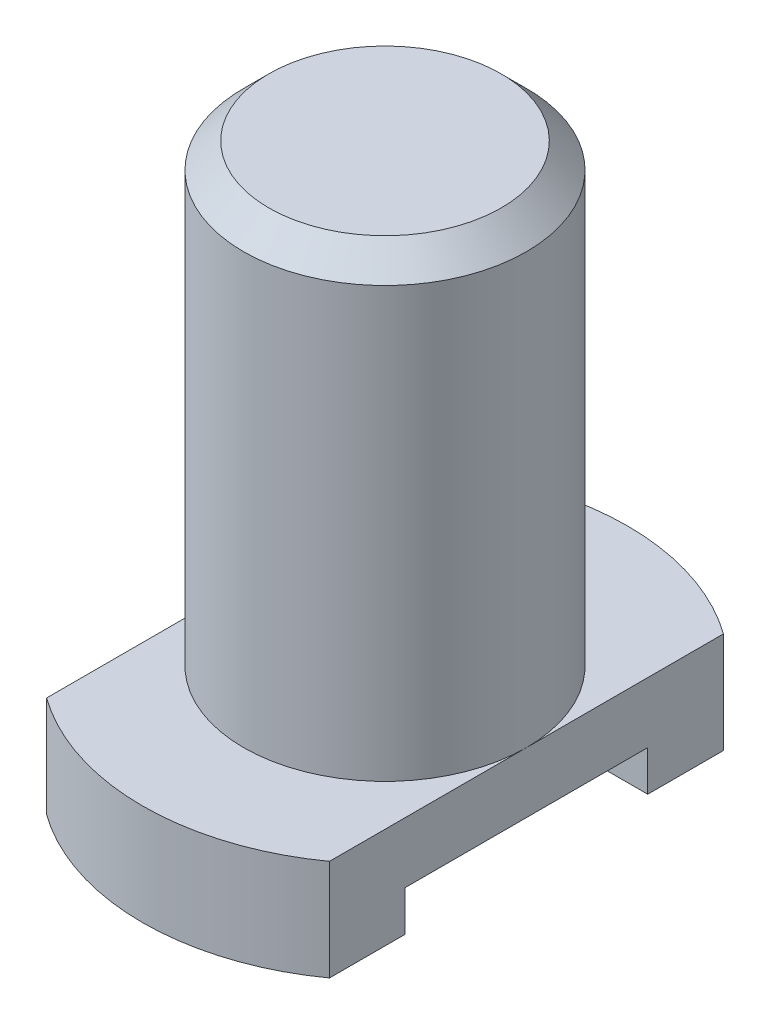
ISO-10303-21;
HEADER;
FILE_DESCRIPTION(('STEP AP214'),'2;1');
FILE_NAME('part.step','',(''),(''),'','','');
FILE_SCHEMA(('AUTOMOTIVE_DESIGN { 1 0 10303 214 1 1 1 1 }'));
ENDSEC;
DATA;
#1=APPLICATION_CONTEXT('core data for automotive mechanical design processes');
#2=APPLICATION_PROTOCOL_DEFINITION('international standard','automotive_design',2000,#1);
#3=PRODUCT_CONTEXT('',#1,'mechanical');
#4=PRODUCT('Part','Part','',(#3));
#5=PRODUCT_RELATED_PRODUCT_CATEGORY('part','',(#4));
#6=PRODUCT_DEFINITION_FORMATION('','',#4);
#7=PRODUCT_DEFINITION_CONTEXT('part definition',#1,'design');
#8=PRODUCT_DEFINITION('design','',#6,#7);
#9=PRODUCT_DEFINITION_SHAPE('','',#8);
#10=(LENGTH_UNIT() NAMED_UNIT(*) SI_UNIT(.MILLI.,.METRE.));
#11=(NAMED_UNIT(*) PLANE_ANGLE_UNIT() SI_UNIT($,.RADIAN.));
#12=(NAMED_UNIT(*) SI_UNIT($,.STERADIAN.) SOLID_ANGLE_UNIT());
#13=UNCERTAINTY_MEASURE_WITH_UNIT(LENGTH_MEASURE(1.E-05),#10,'distance_accuracy_value','');
#14=(GEOMETRIC_REPRESENTATION_CONTEXT(3) GLOBAL_UNCERTAINTY_ASSIGNED_CONTEXT((#13)) GLOBAL_UNIT_ASSIGNED_CONTEXT((#10,
#11,#12)) REPRESENTATION_CONTEXT('',''));
#15=CARTESIAN_POINT('',(0.,0.,0.));
#16=DIRECTION('',(0.,0.,1.));
#17=DIRECTION('',(1.,0.,0.));
#18=AXIS2_PLACEMENT_3D('',#15,#16,#17);
#19=CARTESIAN_POINT('',(0.,0.,0.));
#20=DIRECTION('',(0.,1.,0.));
#21=DIRECTION('',(0.,0.,1.));
#22=AXIS2_PLACEMENT_3D('',#19,#20,#21);
#23=PLANE('',#22);
#24=DIRECTION('',(0.,0.,-1.));
#25=VECTOR('',#24,1.);
#26=CARTESIAN_POINT('',(1.4,0.,0.));
#27=LINE('',#26,#25);
#28=CARTESIAN_POINT('',(1.4,0.,-1.2));
#29=VERTEX_POINT('',#28);
#30=CARTESIAN_POINT('',(1.4,0.,-1.94935886896179));
#31=VERTEX_POINT('',#30);
#32=EDGE_CURVE('E133',#29,#31,#27,.T.);
#33=ORIENTED_EDGE('',*,*,#32,.F.);
#34=DIRECTION('',(-1.,0.,0.));
#35=VECTOR('',#34,1.);
#36=CARTESIAN_POINT('',(0.,0.,-1.2));
#37=LINE('',#36,#35);
#38=CARTESIAN_POINT('',(-1.4,0.,-1.2));
#39=VERTEX_POINT('',#38);
#40=EDGE_CURVE('E43',#29,#39,#37,.T.);
#41=ORIENTED_EDGE('',*,*,#40,.T.);
#42=DIRECTION('',(0.,0.,-1.));
#43=VECTOR('',#42,1.);
#44=CARTESIAN_POINT('',(-1.4,0.,0.));
#45=LINE('',#44,#43);
#46=CARTESIAN_POINT('',(-1.4,0.,-1.94935886896179));
#47=VERTEX_POINT('',#46);
#48=EDGE_CURVE('E149',#39,#47,#45,.T.);
#49=ORIENTED_EDGE('',*,*,#48,.T.);
#50=CARTESIAN_POINT('',(0.,0.,0.));
#51=DIRECTION('',(0.,1.,0.));
#52=DIRECTION('',(0.,0.,1.));
#53=AXIS2_PLACEMENT_3D('',#50,#51,#52);
#54=CIRCLE('',#53,2.4);
#55=EDGE_CURVE('E146',#31,#47,#54,.T.);
#56=ORIENTED_EDGE('',*,*,#55,.F.);
#57=EDGE_LOOP('',(#33,#41,#49,#56));
#58=FACE_BOUND('',#57,.T.);
#59=ADVANCED_FACE('F35',(#58),#23,.F.);
#60=CARTESIAN_POINT('',(0.,5.5,0.));
#61=DIRECTION('',(0.,-1.,0.));
#62=DIRECTION('',(0.,0.,-1.));
#63=AXIS2_PLACEMENT_3D('',#60,#61,#62);
#64=CYLINDRICAL_SURFACE('',#63,1.4);
#65=CARTESIAN_POINT('',(0.,5.25,0.));
#66=DIRECTION('',(0.,1.,0.));
#67=DIRECTION('',(0.,0.,1.));
#68=AXIS2_PLACEMENT_3D('',#65,#66,#67);
#69=CIRCLE('',#68,1.4);
#70=CARTESIAN_POINT('',(0.,5.25,1.4));
#71=VERTEX_POINT('',#70);
#72=EDGE_CURVE('E173',#71,#71,#69,.F.);
#73=ORIENTED_EDGE('',*,*,#72,.T.);
#74=EDGE_LOOP('',(#73));
#75=FACE_BOUND('',#74,.T.);
#76=CARTESIAN_POINT('',(0.,1.,0.));
#77=DIRECTION('',(0.,1.,0.));
#78=DIRECTION('',(0.,0.,1.));
#79=AXIS2_PLACEMENT_3D('',#76,#77,#78);
#80=CIRCLE('',#79,1.4);
#81=CARTESIAN_POINT('',(-1.4,1.,0.));
#82=VERTEX_POINT('',#81);
#83=CARTESIAN_POINT('',(1.4,1.,0.));
#84=VERTEX_POINT('',#83);
#85=EDGE_CURVE('E166',#82,#84,#80,.T.);
#86=ORIENTED_EDGE('',*,*,#85,.T.);
#87=EDGE_CURVE('E169',#84,#82,#80,.T.);
#88=ORIENTED_EDGE('',*,*,#87,.T.);
#89=EDGE_LOOP('',(#86,#88));
#90=FACE_BOUND('',#89,.T.);
#91=ADVANCED_FACE('F193',(#75,#90),#64,.T.);
#92=CARTESIAN_POINT('',(0.,5.5,0.));
#93=DIRECTION('',(0.,1.,0.));
#94=DIRECTION('',(0.,0.,1.));
#95=AXIS2_PLACEMENT_3D('',#92,#93,#94);
#96=PLANE('',#95);
#97=CARTESIAN_POINT('',(0.,5.5,0.));
#98=DIRECTION('',(0.,1.,0.));
#99=DIRECTION('',(0.,0.,1.));
#100=AXIS2_PLACEMENT_3D('',#97,#98,#99);
#101=CIRCLE('',#100,1.15);
#102=CARTESIAN_POINT('',(0.,5.5,1.15));
#103=VERTEX_POINT('',#102);
#104=EDGE_CURVE('E170',#103,#103,#101,.T.);
#105=ORIENTED_EDGE('',*,*,#104,.T.);
#106=EDGE_LOOP('',(#105));
#107=FACE_BOUND('',#106,.T.);
#108=ADVANCED_FACE('F219',(#107),#96,.T.);
#109=CARTESIAN_POINT('',(0.,1.,0.));
#110=DIRECTION('',(0.,1.,0.));
#111=DIRECTION('',(0.,0.,1.));
#112=AXIS2_PLACEMENT_3D('',#109,#110,#111);
#113=PLANE('',#112);
#114=ORIENTED_EDGE('',*,*,#87,.F.);
#115=DIRECTION('',(0.,0.,-1.));
#116=VECTOR('',#115,1.);
#117=CARTESIAN_POINT('',(1.4,1.,0.));
#118=LINE('',#117,#116);
#119=CARTESIAN_POINT('',(1.4,1.,-1.94935886896179));
#120=VERTEX_POINT('',#119);
#121=EDGE_CURVE('E136',#84,#120,#118,.T.);
#122=ORIENTED_EDGE('',*,*,#121,.T.);
#123=CARTESIAN_POINT('',(0.,1.,0.));
#124=DIRECTION('',(0.,1.,0.));
#125=DIRECTION('',(0.,0.,1.));
#126=AXIS2_PLACEMENT_3D('',#123,#124,#125);
#127=CIRCLE('',#126,2.4);
#128=CARTESIAN_POINT('',(-1.4,1.,-1.94935886896179));
#129=VERTEX_POINT('',#128);
#130=EDGE_CURVE('E135',#120,#129,#127,.T.);
#131=ORIENTED_EDGE('',*,*,#130,.T.);
#132=DIRECTION('',(0.,0.,-1.));
#133=VECTOR('',#132,1.);
#134=CARTESIAN_POINT('',(-1.4,1.,0.));
#135=LINE('',#134,#133);
#136=EDGE_CURVE('E139',#82,#129,#135,.T.);
#137=ORIENTED_EDGE('',*,*,#136,.F.);
#138=EDGE_LOOP('',(#114,#122,#131,#137));
#139=FACE_BOUND('',#138,.T.);
#140=ADVANCED_FACE('F191',(#139),#113,.T.);
#141=CARTESIAN_POINT('',(1.4,1.,0.));
#142=DIRECTION('',(-1.,0.,0.));
#143=DIRECTION('',(0.,0.,1.));
#144=AXIS2_PLACEMENT_3D('',#141,#142,#143);
#145=PLANE('',#144);
#146=DIRECTION('',(0.,0.,1.));
#147=VECTOR('',#146,1.);
#148=CARTESIAN_POINT('',(1.4,0.4,1.2));
#149=LINE('',#148,#147);
#150=CARTESIAN_POINT('',(1.4,0.4,-1.2));
#151=VERTEX_POINT('',#150);
#152=CARTESIAN_POINT('',(1.4,0.4,1.2));
#153=VERTEX_POINT('',#152);
#154=EDGE_CURVE('E110',#151,#153,#149,.T.);
#155=ORIENTED_EDGE('',*,*,#154,.F.);
#156=DIRECTION('',(0.,1.,0.));
#157=VECTOR('',#156,1.);
#158=CARTESIAN_POINT('',(1.4,-0.4,-1.2));
#159=LINE('',#158,#157);
#160=EDGE_CURVE('E117',#29,#151,#159,.T.);
#161=ORIENTED_EDGE('',*,*,#160,.F.);
#162=ORIENTED_EDGE('',*,*,#32,.T.);
#163=DIRECTION('',(0.,-1.,0.));
#164=VECTOR('',#163,1.);
#165=CARTESIAN_POINT('',(1.4,1.,-1.94935886896179));
#166=LINE('',#165,#164);
#167=EDGE_CURVE('E163',#120,#31,#166,.T.);
#168=ORIENTED_EDGE('',*,*,#167,.F.);
#169=ORIENTED_EDGE('',*,*,#121,.F.);
#170=CARTESIAN_POINT('',(1.4,1.,1.94935886896179));
#171=VERTEX_POINT('',#170);
#172=EDGE_CURVE('E58',#171,#84,#118,.T.);
#173=ORIENTED_EDGE('',*,*,#172,.F.);
#174=DIRECTION('',(0.,-1.,0.));
#175=VECTOR('',#174,1.);
#176=CARTESIAN_POINT('',(1.4,1.,1.94935886896179));
#177=LINE('',#176,#175);
#178=CARTESIAN_POINT('',(1.4,0.,1.94935886896179));
#179=VERTEX_POINT('',#178);
#180=EDGE_CURVE('E154',#171,#179,#177,.T.);
#181=ORIENTED_EDGE('',*,*,#180,.T.);
#182=CARTESIAN_POINT('',(1.4,0.,1.2));
#183=VERTEX_POINT('',#182);
#184=EDGE_CURVE('E144',#179,#183,#27,.T.);
#185=ORIENTED_EDGE('',*,*,#184,.T.);
#186=DIRECTION('',(0.,-1.,0.));
#187=VECTOR('',#186,1.);
#188=CARTESIAN_POINT('',(1.4,-0.4,1.2));
#189=LINE('',#188,#187);
#190=EDGE_CURVE('E50',#153,#183,#189,.T.);
#191=ORIENTED_EDGE('',*,*,#190,.F.);
#192=EDGE_LOOP('',(#155,#161,#162,#168,#169,#173,#181,#185,#191));
#193=FACE_BOUND('',#192,.T.);
#194=ADVANCED_FACE('F123',(#193),#145,.F.);
#195=CARTESIAN_POINT('',(-1.4,1.,0.));
#196=DIRECTION('',(-1.,0.,0.));
#197=DIRECTION('',(0.,0.,1.));
#198=AXIS2_PLACEMENT_3D('',#195,#196,#197);
#199=PLANE('',#198);
#200=DIRECTION('',(0.,-1.,0.));
#201=VECTOR('',#200,1.);
#202=CARTESIAN_POINT('',(-1.4,1.,-1.2));
#203=LINE('',#202,#201);
#204=CARTESIAN_POINT('',(-1.4,0.4,-1.2));
#205=VERTEX_POINT('',#204);
#206=EDGE_CURVE('E131',#205,#39,#203,.T.);
#207=ORIENTED_EDGE('',*,*,#206,.F.);
#208=DIRECTION('',(0.,0.,-1.));
#209=VECTOR('',#208,1.);
#210=CARTESIAN_POINT('',(-1.4,0.4,0.));
#211=LINE('',#210,#209);
#212=CARTESIAN_POINT('',(-1.4,0.4,1.2));
#213=VERTEX_POINT('',#212);
#214=EDGE_CURVE('E11',#213,#205,#211,.T.);
#215=ORIENTED_EDGE('',*,*,#214,.F.);
#216=DIRECTION('',(0.,1.,0.));
#217=VECTOR('',#216,1.);
#218=CARTESIAN_POINT('',(-1.4,1.,1.2));
#219=LINE('',#218,#217);
#220=CARTESIAN_POINT('',(-1.4,0.,1.2));
#221=VERTEX_POINT('',#220);
#222=EDGE_CURVE('E128',#221,#213,#219,.T.);
#223=ORIENTED_EDGE('',*,*,#222,.F.);
#224=CARTESIAN_POINT('',(-1.4,0.,1.94935886896179));
#225=VERTEX_POINT('',#224);
#226=EDGE_CURVE('E151',#225,#221,#45,.T.);
#227=ORIENTED_EDGE('',*,*,#226,.F.);
#228=DIRECTION('',(0.,-1.,0.));
#229=VECTOR('',#228,1.);
#230=CARTESIAN_POINT('',(-1.4,1.,1.94935886896179));
#231=LINE('',#230,#229);
#232=CARTESIAN_POINT('',(-1.4,1.,1.94935886896179));
#233=VERTEX_POINT('',#232);
#234=EDGE_CURVE('E157',#233,#225,#231,.T.);
#235=ORIENTED_EDGE('',*,*,#234,.F.);
#236=EDGE_CURVE('E141',#233,#82,#135,.T.);
#237=ORIENTED_EDGE('',*,*,#236,.T.);
#238=ORIENTED_EDGE('',*,*,#136,.T.);
#239=DIRECTION('',(0.,-1.,0.));
#240=VECTOR('',#239,1.);
#241=CARTESIAN_POINT('',(-1.4,1.,-1.94935886896179));
#242=LINE('',#241,#240);
#243=EDGE_CURVE('E160',#129,#47,#242,.T.);
#244=ORIENTED_EDGE('',*,*,#243,.T.);
#245=ORIENTED_EDGE('',*,*,#48,.F.);
#246=EDGE_LOOP('',(#207,#215,#223,#227,#235,#237,#238,#244,#245));
#247=FACE_BOUND('',#246,.T.);
#248=ADVANCED_FACE('F181',(#247),#199,.T.);
#249=CARTESIAN_POINT('',(0.,1.,0.));
#250=DIRECTION('',(0.,-1.,0.));
#251=DIRECTION('',(0.,0.,-1.));
#252=AXIS2_PLACEMENT_3D('',#249,#250,#251);
#253=CYLINDRICAL_SURFACE('',#252,2.4);
#254=ORIENTED_EDGE('',*,*,#55,.T.);
#255=ORIENTED_EDGE('',*,*,#243,.F.);
#256=ORIENTED_EDGE('',*,*,#130,.F.);
#257=ORIENTED_EDGE('',*,*,#167,.T.);
#258=EDGE_LOOP('',(#254,#255,#256,#257));
#259=FACE_BOUND('',#258,.T.);
#260=ADVANCED_FACE('F186',(#259),#253,.T.);
#261=EDGE_CURVE('E150',#225,#179,#54,.T.);
#262=ORIENTED_EDGE('',*,*,#261,.T.);
#263=ORIENTED_EDGE('',*,*,#180,.F.);
#264=EDGE_CURVE('E140',#233,#171,#127,.T.);
#265=ORIENTED_EDGE('',*,*,#264,.F.);
#266=ORIENTED_EDGE('',*,*,#234,.T.);
#267=EDGE_LOOP('',(#262,#263,#265,#266));
#268=FACE_BOUND('',#267,.T.);
#269=ADVANCED_FACE('F202',(#268),#253,.T.);
#270=ORIENTED_EDGE('',*,*,#85,.F.);
#271=ORIENTED_EDGE('',*,*,#236,.F.);
#272=ORIENTED_EDGE('',*,*,#264,.T.);
#273=ORIENTED_EDGE('',*,*,#172,.T.);
#274=EDGE_LOOP('',(#270,#271,#272,#273));
#275=FACE_BOUND('',#274,.T.);
#276=ADVANCED_FACE('F195',(#275),#113,.T.);
#277=ORIENTED_EDGE('',*,*,#226,.T.);
#278=DIRECTION('',(1.,0.,0.));
#279=VECTOR('',#278,1.);
#280=CARTESIAN_POINT('',(0.,0.,1.2));
#281=LINE('',#280,#279);
#282=EDGE_CURVE('E176',#221,#183,#281,.T.);
#283=ORIENTED_EDGE('',*,*,#282,.T.);
#284=ORIENTED_EDGE('',*,*,#184,.F.);
#285=ORIENTED_EDGE('',*,*,#261,.F.);
#286=EDGE_LOOP('',(#277,#283,#284,#285));
#287=FACE_BOUND('',#286,.T.);
#288=ADVANCED_FACE('F204',(#287),#23,.F.);
#289=CARTESIAN_POINT('',(0.,5.5,0.));
#290=DIRECTION('',(0.,-1.,0.));
#291=DIRECTION('',(0.,0.,-1.));
#292=AXIS2_PLACEMENT_3D('',#289,#290,#291);
#293=CONICAL_SURFACE('',#292,1.15,0.785398163397448);
#294=ORIENTED_EDGE('',*,*,#72,.F.);
#295=EDGE_LOOP('',(#294));
#296=FACE_BOUND('',#295,.T.);
#297=ORIENTED_EDGE('',*,*,#104,.F.);
#298=EDGE_LOOP('',(#297));
#299=FACE_BOUND('',#298,.T.);
#300=ADVANCED_FACE('F37',(#296,#299),#293,.T.);
#301=CARTESIAN_POINT('',(-2.2,-0.4,-1.2));
#302=DIRECTION('',(0.,0.,-1.));
#303=DIRECTION('',(-1.,0.,0.));
#304=AXIS2_PLACEMENT_3D('',#301,#302,#303);
#305=PLANE('',#304);
#306=ORIENTED_EDGE('',*,*,#206,.T.);
#307=ORIENTED_EDGE('',*,*,#40,.F.);
#308=ORIENTED_EDGE('',*,*,#160,.T.);
#309=DIRECTION('',(1.,0.,0.));
#310=VECTOR('',#309,1.);
#311=CARTESIAN_POINT('',(-2.2,0.4,-1.2));
#312=LINE('',#311,#310);
#313=EDGE_CURVE('E105',#205,#151,#312,.T.);
#314=ORIENTED_EDGE('',*,*,#313,.F.);
#315=EDGE_LOOP('',(#306,#307,#308,#314));
#316=FACE_BOUND('',#315,.T.);
#317=ADVANCED_FACE('F118',(#316),#305,.F.);
#318=CARTESIAN_POINT('',(-2.2,-0.4,1.2));
#319=DIRECTION('',(0.,0.,1.));
#320=DIRECTION('',(1.,0.,0.));
#321=AXIS2_PLACEMENT_3D('',#318,#319,#320);
#322=PLANE('',#321);
#323=ORIENTED_EDGE('',*,*,#222,.T.);
#324=DIRECTION('',(1.,0.,0.));
#325=VECTOR('',#324,1.);
#326=CARTESIAN_POINT('',(-2.2,0.4,1.2));
#327=LINE('',#326,#325);
#328=EDGE_CURVE('E114',#213,#153,#327,.T.);
#329=ORIENTED_EDGE('',*,*,#328,.T.);
#330=ORIENTED_EDGE('',*,*,#190,.T.);
#331=ORIENTED_EDGE('',*,*,#282,.F.);
#332=EDGE_LOOP('',(#323,#329,#330,#331));
#333=FACE_BOUND('',#332,.T.);
#334=ADVANCED_FACE('F205',(#333),#322,.F.);
#335=CARTESIAN_POINT('',(-2.2,0.4,1.2));
#336=DIRECTION('',(0.,1.,0.));
#337=DIRECTION('',(0.,0.,1.));
#338=AXIS2_PLACEMENT_3D('',#335,#336,#337);
#339=PLANE('',#338);
#340=ORIENTED_EDGE('',*,*,#214,.T.);
#341=ORIENTED_EDGE('',*,*,#313,.T.);
#342=ORIENTED_EDGE('',*,*,#154,.T.);
#343=ORIENTED_EDGE('',*,*,#328,.F.);
#344=EDGE_LOOP('',(#340,#341,#342,#343));
#345=FACE_BOUND('',#344,.T.);
#346=ADVANCED_FACE('F107',(#345),#339,.F.);
#347=CLOSED_SHELL('',(#59,#91,#108,#140,#194,#248,#260,#269,#276,#288,#300,#317,#334,#346));
#348=MANIFOLD_SOLID_BREP('B2',#347);
#349=ADVANCED_BREP_SHAPE_REPRESENTATION('',(#18,#348),#14);
#350=SHAPE_DEFINITION_REPRESENTATION(#9,#349);
ENDSEC;
END-ISO-10303-21;
